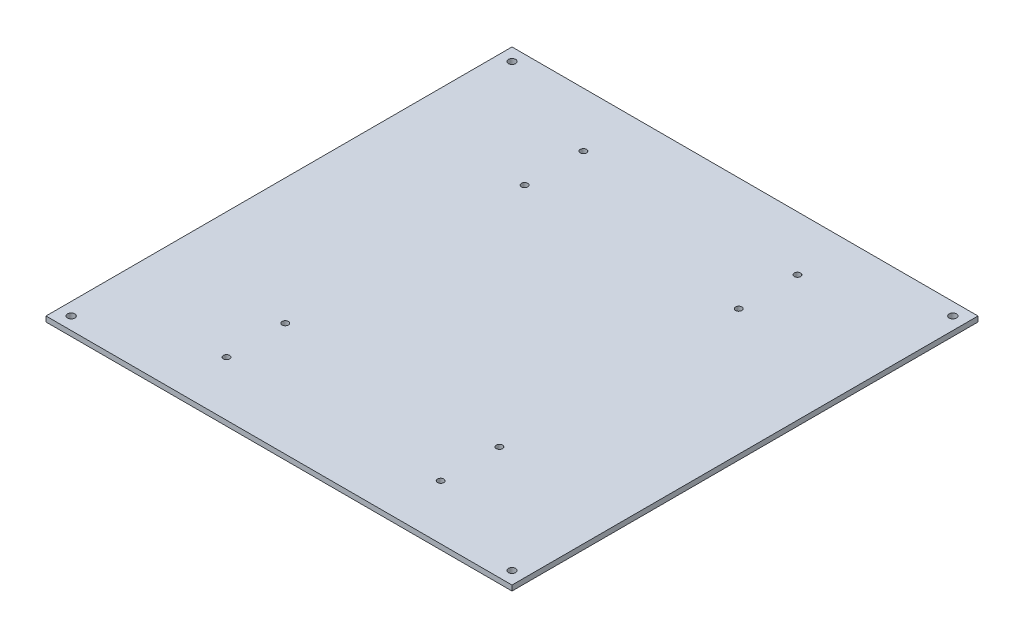
ISO-10303-21;
HEADER;
FILE_DESCRIPTION(('STEP AP214'),'2;1');
FILE_NAME('part.step','',(''),(''),'','','');
FILE_SCHEMA(('AUTOMOTIVE_DESIGN { 1 0 10303 214 1 1 1 1 }'));
ENDSEC;
DATA;
#1=APPLICATION_CONTEXT('core data for automotive mechanical design processes');
#2=APPLICATION_PROTOCOL_DEFINITION('international standard','automotive_design',2000,#1);
#3=PRODUCT_CONTEXT('',#1,'mechanical');
#4=PRODUCT('Part','Part','',(#3));
#5=PRODUCT_RELATED_PRODUCT_CATEGORY('part','',(#4));
#6=PRODUCT_DEFINITION_FORMATION('','',#4);
#7=PRODUCT_DEFINITION_CONTEXT('part definition',#1,'design');
#8=PRODUCT_DEFINITION('design','',#6,#7);
#9=PRODUCT_DEFINITION_SHAPE('','',#8);
#10=(LENGTH_UNIT() NAMED_UNIT(*) SI_UNIT(.MILLI.,.METRE.));
#11=(NAMED_UNIT(*) PLANE_ANGLE_UNIT() SI_UNIT($,.RADIAN.));
#12=(NAMED_UNIT(*) SI_UNIT($,.STERADIAN.) SOLID_ANGLE_UNIT());
#13=UNCERTAINTY_MEASURE_WITH_UNIT(LENGTH_MEASURE(1.E-05),#10,'distance_accuracy_value','');
#14=(GEOMETRIC_REPRESENTATION_CONTEXT(3) GLOBAL_UNCERTAINTY_ASSIGNED_CONTEXT((#13)) GLOBAL_UNIT_ASSIGNED_CONTEXT((#10,
#11,#12)) REPRESENTATION_CONTEXT('',''));
#15=CARTESIAN_POINT('',(0.,0.,0.));
#16=DIRECTION('',(0.,0.,1.));
#17=DIRECTION('',(1.,0.,0.));
#18=AXIS2_PLACEMENT_3D('',#15,#16,#17);
#19=CARTESIAN_POINT('',(0.,2.5,0.));
#20=DIRECTION('',(0.,-1.,0.));
#21=DIRECTION('',(0.,0.,-1.));
#22=AXIS2_PLACEMENT_3D('',#19,#20,#21);
#23=PLANE('',#22);
#24=CARTESIAN_POINT('',(60.,2.5,-54.));
#25=DIRECTION('',(0.,-1.,0.));
#26=DIRECTION('',(0.,0.,-1.));
#27=AXIS2_PLACEMENT_3D('',#24,#25,#26);
#28=CIRCLE('',#27,1.5);
#29=CARTESIAN_POINT('',(60.,2.5,-55.5));
#30=VERTEX_POINT('',#29);
#31=EDGE_CURVE('E143',#30,#30,#28,.T.);
#32=ORIENTED_EDGE('',*,*,#31,.T.);
#33=EDGE_LOOP('',(#32));
#34=FACE_BOUND('',#33,.T.);
#35=CARTESIAN_POINT('',(59.9999999999999,2.5,-168.));
#36=DIRECTION('',(0.,-1.,0.));
#37=DIRECTION('',(0.,0.,1.));
#38=AXIS2_PLACEMENT_3D('',#35,#36,#37);
#39=CIRCLE('',#38,1.5);
#40=CARTESIAN_POINT('',(59.9999999999999,2.5,-166.5));
#41=VERTEX_POINT('',#40);
#42=EDGE_CURVE('E162',#41,#41,#39,.T.);
#43=ORIENTED_EDGE('',*,*,#42,.T.);
#44=EDGE_LOOP('',(#43));
#45=FACE_BOUND('',#44,.T.);
#46=CARTESIAN_POINT('',(59.9999999999999,2.5,-196.));
#47=DIRECTION('',(0.,-1.,0.));
#48=DIRECTION('',(0.,0.,1.));
#49=AXIS2_PLACEMENT_3D('',#46,#47,#48);
#50=CIRCLE('',#49,1.5);
#51=CARTESIAN_POINT('',(59.9999999999999,2.5,-194.5));
#52=VERTEX_POINT('',#51);
#53=EDGE_CURVE('E156',#52,#52,#50,.T.);
#54=ORIENTED_EDGE('',*,*,#53,.T.);
#55=EDGE_LOOP('',(#54));
#56=FACE_BOUND('',#55,.T.);
#57=CARTESIAN_POINT('',(162.,2.5,-196.));
#58=DIRECTION('',(0.,-1.,0.));
#59=DIRECTION('',(0.,0.,-1.));
#60=AXIS2_PLACEMENT_3D('',#57,#58,#59);
#61=CIRCLE('',#60,1.5);
#62=CARTESIAN_POINT('',(162.,2.5,-197.5));
#63=VERTEX_POINT('',#62);
#64=EDGE_CURVE('E149',#63,#63,#61,.T.);
#65=ORIENTED_EDGE('',*,*,#64,.T.);
#66=EDGE_LOOP('',(#65));
#67=FACE_BOUND('',#66,.T.);
#68=CARTESIAN_POINT('',(162.,2.5,-168.));
#69=DIRECTION('',(0.,-1.,0.));
#70=DIRECTION('',(0.,0.,-1.));
#71=AXIS2_PLACEMENT_3D('',#68,#69,#70);
#72=CIRCLE('',#71,1.5);
#73=CARTESIAN_POINT('',(162.,2.5,-169.5));
#74=VERTEX_POINT('',#73);
#75=EDGE_CURVE('E150',#74,#74,#72,.T.);
#76=ORIENTED_EDGE('',*,*,#75,.T.);
#77=EDGE_LOOP('',(#76));
#78=FACE_BOUND('',#77,.T.);
#79=CARTESIAN_POINT('',(162.,2.5,-54.));
#80=DIRECTION('',(0.,-1.,0.));
#81=DIRECTION('',(0.,0.,1.));
#82=AXIS2_PLACEMENT_3D('',#79,#80,#81);
#83=CIRCLE('',#82,1.5);
#84=CARTESIAN_POINT('',(162.,2.5,-52.5));
#85=VERTEX_POINT('',#84);
#86=EDGE_CURVE('E179',#85,#85,#83,.T.);
#87=ORIENTED_EDGE('',*,*,#86,.T.);
#88=EDGE_LOOP('',(#87));
#89=FACE_BOUND('',#88,.T.);
#90=CARTESIAN_POINT('',(162.,2.5,-26.));
#91=DIRECTION('',(0.,-1.,0.));
#92=DIRECTION('',(0.,0.,1.));
#93=AXIS2_PLACEMENT_3D('',#90,#91,#92);
#94=CIRCLE('',#93,1.5);
#95=CARTESIAN_POINT('',(162.,2.5,-24.5));
#96=VERTEX_POINT('',#95);
#97=EDGE_CURVE('E173',#96,#96,#94,.T.);
#98=ORIENTED_EDGE('',*,*,#97,.T.);
#99=EDGE_LOOP('',(#98));
#100=FACE_BOUND('',#99,.T.);
#101=CARTESIAN_POINT('',(60.,2.5,-26.));
#102=DIRECTION('',(0.,-1.,0.));
#103=DIRECTION('',(0.,0.,-1.));
#104=AXIS2_PLACEMENT_3D('',#101,#102,#103);
#105=CIRCLE('',#104,1.5);
#106=CARTESIAN_POINT('',(60.,2.5,-27.5));
#107=VERTEX_POINT('',#106);
#108=EDGE_CURVE('E137',#107,#107,#105,.T.);
#109=ORIENTED_EDGE('',*,*,#108,.T.);
#110=EDGE_LOOP('',(#109));
#111=FACE_BOUND('',#110,.T.);
#112=DIRECTION('',(0.,0.,1.));
#113=VECTOR('',#112,1.);
#114=CARTESIAN_POINT('',(0.,2.5,0.));
#115=LINE('',#114,#113);
#116=CARTESIAN_POINT('',(0.,2.5,-222.));
#117=VERTEX_POINT('',#116);
#118=CARTESIAN_POINT('',(0.,2.5,0.));
#119=VERTEX_POINT('',#118);
#120=EDGE_CURVE('E89',#117,#119,#115,.T.);
#121=ORIENTED_EDGE('',*,*,#120,.T.);
#122=DIRECTION('',(1.,0.,0.));
#123=VECTOR('',#122,1.);
#124=CARTESIAN_POINT('',(0.,2.5,0.));
#125=LINE('',#124,#123);
#126=CARTESIAN_POINT('',(222.,2.5,0.));
#127=VERTEX_POINT('',#126);
#128=EDGE_CURVE('E84',#119,#127,#125,.T.);
#129=ORIENTED_EDGE('',*,*,#128,.T.);
#130=DIRECTION('',(0.,0.,-1.));
#131=VECTOR('',#130,1.);
#132=CARTESIAN_POINT('',(222.,2.5,0.));
#133=LINE('',#132,#131);
#134=CARTESIAN_POINT('',(222.,2.5,-222.));
#135=VERTEX_POINT('',#134);
#136=EDGE_CURVE('E87',#127,#135,#133,.T.);
#137=ORIENTED_EDGE('',*,*,#136,.T.);
#138=DIRECTION('',(-1.,0.,0.));
#139=VECTOR('',#138,1.);
#140=CARTESIAN_POINT('',(0.,2.5,-222.));
#141=LINE('',#140,#139);
#142=EDGE_CURVE('E54',#135,#117,#141,.T.);
#143=ORIENTED_EDGE('',*,*,#142,.T.);
#144=EDGE_LOOP('',(#121,#129,#137,#143));
#145=FACE_BOUND('',#144,.T.);
#146=CARTESIAN_POINT('',(6.00000000000005,2.5,-6.00000000000003));
#147=DIRECTION('',(0.,1.,0.));
#148=DIRECTION('',(0.,0.,1.));
#149=AXIS2_PLACEMENT_3D('',#146,#147,#148);
#150=CIRCLE('',#149,1.75);
#151=CARTESIAN_POINT('',(6.00000000000005,2.5,-4.25000000000002));
#152=VERTEX_POINT('',#151);
#153=EDGE_CURVE('E104',#152,#152,#150,.T.);
#154=ORIENTED_EDGE('',*,*,#153,.F.);
#155=EDGE_LOOP('',(#154));
#156=FACE_BOUND('',#155,.T.);
#157=CARTESIAN_POINT('',(216.,2.5,-6.00000000000007));
#158=DIRECTION('',(0.,1.,0.));
#159=DIRECTION('',(0.,0.,1.));
#160=AXIS2_PLACEMENT_3D('',#157,#158,#159);
#161=CIRCLE('',#160,1.75000000000001);
#162=CARTESIAN_POINT('',(216.,2.5,-4.25000000000006));
#163=VERTEX_POINT('',#162);
#164=EDGE_CURVE('E119',#163,#163,#161,.T.);
#165=ORIENTED_EDGE('',*,*,#164,.F.);
#166=EDGE_LOOP('',(#165));
#167=FACE_BOUND('',#166,.T.);
#168=CARTESIAN_POINT('',(216.,2.5,-216.));
#169=DIRECTION('',(0.,1.,0.));
#170=DIRECTION('',(0.,0.,1.));
#171=AXIS2_PLACEMENT_3D('',#168,#169,#170);
#172=CIRCLE('',#171,1.75000000000001);
#173=CARTESIAN_POINT('',(216.,2.5,-214.25));
#174=VERTEX_POINT('',#173);
#175=EDGE_CURVE('E125',#174,#174,#172,.T.);
#176=ORIENTED_EDGE('',*,*,#175,.F.);
#177=EDGE_LOOP('',(#176));
#178=FACE_BOUND('',#177,.T.);
#179=CARTESIAN_POINT('',(6.00000000000001,2.5,-216.));
#180=DIRECTION('',(0.,1.,0.));
#181=DIRECTION('',(0.,0.,1.));
#182=AXIS2_PLACEMENT_3D('',#179,#180,#181);
#183=CIRCLE('',#182,1.75);
#184=CARTESIAN_POINT('',(6.00000000000001,2.5,-214.25));
#185=VERTEX_POINT('',#184);
#186=EDGE_CURVE('E131',#185,#185,#183,.T.);
#187=ORIENTED_EDGE('',*,*,#186,.F.);
#188=EDGE_LOOP('',(#187));
#189=FACE_BOUND('',#188,.T.);
#190=ADVANCED_FACE('F37',(#34,#45,#56,#67,#78,#89,#100,#111,#145,#156,#167,#178,#189),#23,.F.);
#191=CARTESIAN_POINT('',(0.,0.,0.));
#192=DIRECTION('',(0.,-1.,0.));
#193=DIRECTION('',(0.,0.,-1.));
#194=AXIS2_PLACEMENT_3D('',#191,#192,#193);
#195=PLANE('',#194);
#196=CARTESIAN_POINT('',(60.,0.,-54.));
#197=DIRECTION('',(0.,-1.,0.));
#198=DIRECTION('',(0.,0.,-1.));
#199=AXIS2_PLACEMENT_3D('',#196,#197,#198);
#200=CIRCLE('',#199,1.5);
#201=CARTESIAN_POINT('',(60.,0.,-55.5));
#202=VERTEX_POINT('',#201);
#203=EDGE_CURVE('E165',#202,#202,#200,.T.);
#204=ORIENTED_EDGE('',*,*,#203,.F.);
#205=EDGE_LOOP('',(#204));
#206=FACE_BOUND('',#205,.T.);
#207=CARTESIAN_POINT('',(59.9999999999999,0.,-168.));
#208=DIRECTION('',(0.,-1.,0.));
#209=DIRECTION('',(0.,0.,1.));
#210=AXIS2_PLACEMENT_3D('',#207,#208,#209);
#211=CIRCLE('',#210,1.5);
#212=CARTESIAN_POINT('',(59.9999999999999,0.,-166.5));
#213=VERTEX_POINT('',#212);
#214=EDGE_CURVE('E159',#213,#213,#211,.T.);
#215=ORIENTED_EDGE('',*,*,#214,.F.);
#216=EDGE_LOOP('',(#215));
#217=FACE_BOUND('',#216,.T.);
#218=CARTESIAN_POINT('',(59.9999999999999,0.,-196.));
#219=DIRECTION('',(0.,-1.,0.));
#220=DIRECTION('',(0.,0.,1.));
#221=AXIS2_PLACEMENT_3D('',#218,#219,#220);
#222=CIRCLE('',#221,1.5);
#223=CARTESIAN_POINT('',(59.9999999999999,0.,-194.5));
#224=VERTEX_POINT('',#223);
#225=EDGE_CURVE('E153',#224,#224,#222,.T.);
#226=ORIENTED_EDGE('',*,*,#225,.F.);
#227=EDGE_LOOP('',(#226));
#228=FACE_BOUND('',#227,.T.);
#229=CARTESIAN_POINT('',(162.,0.,-196.));
#230=DIRECTION('',(0.,-1.,0.));
#231=DIRECTION('',(0.,0.,-1.));
#232=AXIS2_PLACEMENT_3D('',#229,#230,#231);
#233=CIRCLE('',#232,1.5);
#234=CARTESIAN_POINT('',(162.,0.,-197.5));
#235=VERTEX_POINT('',#234);
#236=EDGE_CURVE('E146',#235,#235,#233,.T.);
#237=ORIENTED_EDGE('',*,*,#236,.F.);
#238=EDGE_LOOP('',(#237));
#239=FACE_BOUND('',#238,.T.);
#240=CARTESIAN_POINT('',(162.,0.,-168.));
#241=DIRECTION('',(0.,-1.,0.));
#242=DIRECTION('',(0.,0.,-1.));
#243=AXIS2_PLACEMENT_3D('',#240,#241,#242);
#244=CIRCLE('',#243,1.5);
#245=CARTESIAN_POINT('',(162.,0.,-169.5));
#246=VERTEX_POINT('',#245);
#247=EDGE_CURVE('E182',#246,#246,#244,.T.);
#248=ORIENTED_EDGE('',*,*,#247,.F.);
#249=EDGE_LOOP('',(#248));
#250=FACE_BOUND('',#249,.T.);
#251=CARTESIAN_POINT('',(162.,0.,-54.));
#252=DIRECTION('',(0.,-1.,0.));
#253=DIRECTION('',(0.,0.,1.));
#254=AXIS2_PLACEMENT_3D('',#251,#252,#253);
#255=CIRCLE('',#254,1.5);
#256=CARTESIAN_POINT('',(162.,0.,-52.5));
#257=VERTEX_POINT('',#256);
#258=EDGE_CURVE('E176',#257,#257,#255,.T.);
#259=ORIENTED_EDGE('',*,*,#258,.F.);
#260=EDGE_LOOP('',(#259));
#261=FACE_BOUND('',#260,.T.);
#262=CARTESIAN_POINT('',(162.,0.,-26.));
#263=DIRECTION('',(0.,-1.,0.));
#264=DIRECTION('',(0.,0.,1.));
#265=AXIS2_PLACEMENT_3D('',#262,#263,#264);
#266=CIRCLE('',#265,1.5);
#267=CARTESIAN_POINT('',(162.,0.,-24.5));
#268=VERTEX_POINT('',#267);
#269=EDGE_CURVE('E170',#268,#268,#266,.T.);
#270=ORIENTED_EDGE('',*,*,#269,.F.);
#271=EDGE_LOOP('',(#270));
#272=FACE_BOUND('',#271,.T.);
#273=CARTESIAN_POINT('',(60.,0.,-26.));
#274=DIRECTION('',(0.,-1.,0.));
#275=DIRECTION('',(0.,0.,-1.));
#276=AXIS2_PLACEMENT_3D('',#273,#274,#275);
#277=CIRCLE('',#276,1.5);
#278=CARTESIAN_POINT('',(60.,0.,-27.5));
#279=VERTEX_POINT('',#278);
#280=EDGE_CURVE('E140',#279,#279,#277,.T.);
#281=ORIENTED_EDGE('',*,*,#280,.F.);
#282=EDGE_LOOP('',(#281));
#283=FACE_BOUND('',#282,.T.);
#284=CARTESIAN_POINT('',(216.,0.,-216.));
#285=DIRECTION('',(0.,1.,0.));
#286=DIRECTION('',(0.,0.,1.));
#287=AXIS2_PLACEMENT_3D('',#284,#285,#286);
#288=CIRCLE('',#287,1.75000000000001);
#289=CARTESIAN_POINT('',(216.,0.,-214.25));
#290=VERTEX_POINT('',#289);
#291=EDGE_CURVE('E128',#290,#290,#288,.T.);
#292=ORIENTED_EDGE('',*,*,#291,.T.);
#293=EDGE_LOOP('',(#292));
#294=FACE_BOUND('',#293,.T.);
#295=CARTESIAN_POINT('',(6.00000000000005,0.,-6.00000000000003));
#296=DIRECTION('',(0.,1.,0.));
#297=DIRECTION('',(0.,0.,1.));
#298=AXIS2_PLACEMENT_3D('',#295,#296,#297);
#299=CIRCLE('',#298,1.75);
#300=CARTESIAN_POINT('',(6.00000000000005,0.,-4.25000000000002));
#301=VERTEX_POINT('',#300);
#302=EDGE_CURVE('E116',#301,#301,#299,.T.);
#303=ORIENTED_EDGE('',*,*,#302,.T.);
#304=EDGE_LOOP('',(#303));
#305=FACE_BOUND('',#304,.T.);
#306=DIRECTION('',(0.,0.,1.));
#307=VECTOR('',#306,1.);
#308=CARTESIAN_POINT('',(0.,0.,0.));
#309=LINE('',#308,#307);
#310=CARTESIAN_POINT('',(0.,0.,-222.));
#311=VERTEX_POINT('',#310);
#312=CARTESIAN_POINT('',(0.,0.,0.));
#313=VERTEX_POINT('',#312);
#314=EDGE_CURVE('E101',#311,#313,#309,.T.);
#315=ORIENTED_EDGE('',*,*,#314,.F.);
#316=DIRECTION('',(-1.,0.,0.));
#317=VECTOR('',#316,1.);
#318=CARTESIAN_POINT('',(0.,0.,-222.));
#319=LINE('',#318,#317);
#320=CARTESIAN_POINT('',(222.,0.,-222.));
#321=VERTEX_POINT('',#320);
#322=EDGE_CURVE('E77',#321,#311,#319,.T.);
#323=ORIENTED_EDGE('',*,*,#322,.F.);
#324=DIRECTION('',(0.,0.,-1.));
#325=VECTOR('',#324,1.);
#326=CARTESIAN_POINT('',(222.,0.,0.));
#327=LINE('',#326,#325);
#328=CARTESIAN_POINT('',(222.,0.,0.));
#329=VERTEX_POINT('',#328);
#330=EDGE_CURVE('E71',#329,#321,#327,.T.);
#331=ORIENTED_EDGE('',*,*,#330,.F.);
#332=DIRECTION('',(1.,0.,0.));
#333=VECTOR('',#332,1.);
#334=CARTESIAN_POINT('',(0.,0.,0.));
#335=LINE('',#334,#333);
#336=EDGE_CURVE('E93',#313,#329,#335,.T.);
#337=ORIENTED_EDGE('',*,*,#336,.F.);
#338=EDGE_LOOP('',(#315,#323,#331,#337));
#339=FACE_BOUND('',#338,.T.);
#340=CARTESIAN_POINT('',(216.,0.,-6.00000000000007));
#341=DIRECTION('',(0.,1.,0.));
#342=DIRECTION('',(0.,0.,1.));
#343=AXIS2_PLACEMENT_3D('',#340,#341,#342);
#344=CIRCLE('',#343,1.75000000000001);
#345=CARTESIAN_POINT('',(216.,0.,-4.25000000000006));
#346=VERTEX_POINT('',#345);
#347=EDGE_CURVE('E122',#346,#346,#344,.T.);
#348=ORIENTED_EDGE('',*,*,#347,.T.);
#349=EDGE_LOOP('',(#348));
#350=FACE_BOUND('',#349,.T.);
#351=CARTESIAN_POINT('',(6.00000000000001,0.,-216.));
#352=DIRECTION('',(0.,1.,0.));
#353=DIRECTION('',(0.,0.,1.));
#354=AXIS2_PLACEMENT_3D('',#351,#352,#353);
#355=CIRCLE('',#354,1.75);
#356=CARTESIAN_POINT('',(6.00000000000001,0.,-214.25));
#357=VERTEX_POINT('',#356);
#358=EDGE_CURVE('E134',#357,#357,#355,.T.);
#359=ORIENTED_EDGE('',*,*,#358,.T.);
#360=EDGE_LOOP('',(#359));
#361=FACE_BOUND('',#360,.T.);
#362=ADVANCED_FACE('F112',(#206,#217,#228,#239,#250,#261,#272,#283,#294,#305,#339,#350,#361),
#195,.T.);
#363=CARTESIAN_POINT('',(0.,2.5,0.));
#364=DIRECTION('',(1.,0.,0.));
#365=DIRECTION('',(0.,0.,-1.));
#366=AXIS2_PLACEMENT_3D('',#363,#364,#365);
#367=PLANE('',#366);
#368=ORIENTED_EDGE('',*,*,#314,.T.);
#369=DIRECTION('',(0.,-1.,0.));
#370=VECTOR('',#369,1.);
#371=CARTESIAN_POINT('',(0.,2.5,0.));
#372=LINE('',#371,#370);
#373=EDGE_CURVE('E11',#119,#313,#372,.T.);
#374=ORIENTED_EDGE('',*,*,#373,.F.);
#375=ORIENTED_EDGE('',*,*,#120,.F.);
#376=DIRECTION('',(0.,-1.,0.));
#377=VECTOR('',#376,1.);
#378=CARTESIAN_POINT('',(0.,2.5,-222.));
#379=LINE('',#378,#377);
#380=EDGE_CURVE('E97',#117,#311,#379,.T.);
#381=ORIENTED_EDGE('',*,*,#380,.T.);
#382=EDGE_LOOP('',(#368,#374,#375,#381));
#383=FACE_BOUND('',#382,.T.);
#384=ADVANCED_FACE('F39',(#383),#367,.F.);
#385=CARTESIAN_POINT('',(0.,2.5,0.));
#386=DIRECTION('',(0.,0.,-1.));
#387=DIRECTION('',(-1.,0.,0.));
#388=AXIS2_PLACEMENT_3D('',#385,#386,#387);
#389=PLANE('',#388);
#390=ORIENTED_EDGE('',*,*,#336,.T.);
#391=DIRECTION('',(0.,-1.,0.));
#392=VECTOR('',#391,1.);
#393=CARTESIAN_POINT('',(222.,2.5,0.));
#394=LINE('',#393,#392);
#395=EDGE_CURVE('E46',#127,#329,#394,.T.);
#396=ORIENTED_EDGE('',*,*,#395,.F.);
#397=ORIENTED_EDGE('',*,*,#128,.F.);
#398=ORIENTED_EDGE('',*,*,#373,.T.);
#399=EDGE_LOOP('',(#390,#396,#397,#398));
#400=FACE_BOUND('',#399,.T.);
#401=ADVANCED_FACE('F92',(#400),#389,.F.);
#402=CARTESIAN_POINT('',(222.,2.5,0.));
#403=DIRECTION('',(-1.,0.,0.));
#404=DIRECTION('',(0.,0.,1.));
#405=AXIS2_PLACEMENT_3D('',#402,#403,#404);
#406=PLANE('',#405);
#407=ORIENTED_EDGE('',*,*,#330,.T.);
#408=DIRECTION('',(0.,-1.,0.));
#409=VECTOR('',#408,1.);
#410=CARTESIAN_POINT('',(222.,2.5,-222.));
#411=LINE('',#410,#409);
#412=EDGE_CURVE('E94',#135,#321,#411,.T.);
#413=ORIENTED_EDGE('',*,*,#412,.F.);
#414=ORIENTED_EDGE('',*,*,#136,.F.);
#415=ORIENTED_EDGE('',*,*,#395,.T.);
#416=EDGE_LOOP('',(#407,#413,#414,#415));
#417=FACE_BOUND('',#416,.T.);
#418=ADVANCED_FACE('F95',(#417),#406,.F.);
#419=CARTESIAN_POINT('',(0.,2.5,-222.));
#420=DIRECTION('',(0.,0.,1.));
#421=DIRECTION('',(1.,0.,0.));
#422=AXIS2_PLACEMENT_3D('',#419,#420,#421);
#423=PLANE('',#422);
#424=ORIENTED_EDGE('',*,*,#322,.T.);
#425=ORIENTED_EDGE('',*,*,#380,.F.);
#426=ORIENTED_EDGE('',*,*,#142,.F.);
#427=ORIENTED_EDGE('',*,*,#412,.T.);
#428=EDGE_LOOP('',(#424,#425,#426,#427));
#429=FACE_BOUND('',#428,.T.);
#430=ADVANCED_FACE('F109',(#429),#423,.F.);
#431=CARTESIAN_POINT('',(6.00000000000005,2.5,-6.00000000000003));
#432=DIRECTION('',(0.,-1.,0.));
#433=DIRECTION('',(0.,0.,-1.));
#434=AXIS2_PLACEMENT_3D('',#431,#432,#433);
#435=CYLINDRICAL_SURFACE('',#434,1.75);
#436=ORIENTED_EDGE('',*,*,#153,.T.);
#437=EDGE_LOOP('',(#436));
#438=FACE_BOUND('',#437,.T.);
#439=ORIENTED_EDGE('',*,*,#302,.F.);
#440=EDGE_LOOP('',(#439));
#441=FACE_BOUND('',#440,.T.);
#442=ADVANCED_FACE('F212',(#438,#441),#435,.F.);
#443=CARTESIAN_POINT('',(216.,2.5,-6.00000000000007));
#444=DIRECTION('',(0.,-1.,0.));
#445=DIRECTION('',(0.,0.,-1.));
#446=AXIS2_PLACEMENT_3D('',#443,#444,#445);
#447=CYLINDRICAL_SURFACE('',#446,1.75000000000001);
#448=ORIENTED_EDGE('',*,*,#164,.T.);
#449=EDGE_LOOP('',(#448));
#450=FACE_BOUND('',#449,.T.);
#451=ORIENTED_EDGE('',*,*,#347,.F.);
#452=EDGE_LOOP('',(#451));
#453=FACE_BOUND('',#452,.T.);
#454=ADVANCED_FACE('F214',(#450,#453),#447,.F.);
#455=CARTESIAN_POINT('',(216.,2.5,-216.));
#456=DIRECTION('',(0.,-1.,0.));
#457=DIRECTION('',(0.,0.,-1.));
#458=AXIS2_PLACEMENT_3D('',#455,#456,#457);
#459=CYLINDRICAL_SURFACE('',#458,1.75000000000001);
#460=ORIENTED_EDGE('',*,*,#175,.T.);
#461=EDGE_LOOP('',(#460));
#462=FACE_BOUND('',#461,.T.);
#463=ORIENTED_EDGE('',*,*,#291,.F.);
#464=EDGE_LOOP('',(#463));
#465=FACE_BOUND('',#464,.T.);
#466=ADVANCED_FACE('F221',(#462,#465),#459,.F.);
#467=CARTESIAN_POINT('',(6.00000000000001,2.5,-216.));
#468=DIRECTION('',(0.,-1.,0.));
#469=DIRECTION('',(0.,0.,-1.));
#470=AXIS2_PLACEMENT_3D('',#467,#468,#469);
#471=CYLINDRICAL_SURFACE('',#470,1.75);
#472=ORIENTED_EDGE('',*,*,#186,.T.);
#473=EDGE_LOOP('',(#472));
#474=FACE_BOUND('',#473,.T.);
#475=ORIENTED_EDGE('',*,*,#358,.F.);
#476=EDGE_LOOP('',(#475));
#477=FACE_BOUND('',#476,.T.);
#478=ADVANCED_FACE('F257',(#474,#477),#471,.F.);
#479=CARTESIAN_POINT('',(60.,2.5,-26.));
#480=DIRECTION('',(0.,-1.,0.));
#481=DIRECTION('',(0.,0.,-1.));
#482=AXIS2_PLACEMENT_3D('',#479,#480,#481);
#483=CYLINDRICAL_SURFACE('',#482,1.5);
#484=ORIENTED_EDGE('',*,*,#108,.F.);
#485=EDGE_LOOP('',(#484));
#486=FACE_BOUND('',#485,.T.);
#487=ORIENTED_EDGE('',*,*,#280,.T.);
#488=EDGE_LOOP('',(#487));
#489=FACE_BOUND('',#488,.T.);
#490=ADVANCED_FACE('F251',(#486,#489),#483,.F.);
#491=CARTESIAN_POINT('',(162.,2.5,-26.));
#492=DIRECTION('',(0.,-1.,0.));
#493=DIRECTION('',(0.,0.,-1.));
#494=AXIS2_PLACEMENT_3D('',#491,#492,#493);
#495=CYLINDRICAL_SURFACE('',#494,1.5);
#496=ORIENTED_EDGE('',*,*,#97,.F.);
#497=EDGE_LOOP('',(#496));
#498=FACE_BOUND('',#497,.T.);
#499=ORIENTED_EDGE('',*,*,#269,.T.);
#500=EDGE_LOOP('',(#499));
#501=FACE_BOUND('',#500,.T.);
#502=ADVANCED_FACE('F256',(#498,#501),#495,.F.);
#503=CARTESIAN_POINT('',(162.,2.5,-54.));
#504=DIRECTION('',(0.,-1.,0.));
#505=DIRECTION('',(0.,0.,-1.));
#506=AXIS2_PLACEMENT_3D('',#503,#504,#505);
#507=CYLINDRICAL_SURFACE('',#506,1.5);
#508=ORIENTED_EDGE('',*,*,#86,.F.);
#509=EDGE_LOOP('',(#508));
#510=FACE_BOUND('',#509,.T.);
#511=ORIENTED_EDGE('',*,*,#258,.T.);
#512=EDGE_LOOP('',(#511));
#513=FACE_BOUND('',#512,.T.);
#514=ADVANCED_FACE('F194',(#510,#513),#507,.F.);
#515=CARTESIAN_POINT('',(162.,2.5,-168.));
#516=DIRECTION('',(0.,-1.,0.));
#517=DIRECTION('',(0.,0.,-1.));
#518=AXIS2_PLACEMENT_3D('',#515,#516,#517);
#519=CYLINDRICAL_SURFACE('',#518,1.5);
#520=ORIENTED_EDGE('',*,*,#75,.F.);
#521=EDGE_LOOP('',(#520));
#522=FACE_BOUND('',#521,.T.);
#523=ORIENTED_EDGE('',*,*,#247,.T.);
#524=EDGE_LOOP('',(#523));
#525=FACE_BOUND('',#524,.T.);
#526=ADVANCED_FACE('F190',(#522,#525),#519,.F.);
#527=CARTESIAN_POINT('',(162.,2.5,-196.));
#528=DIRECTION('',(0.,-1.,0.));
#529=DIRECTION('',(0.,0.,-1.));
#530=AXIS2_PLACEMENT_3D('',#527,#528,#529);
#531=CYLINDRICAL_SURFACE('',#530,1.5);
#532=ORIENTED_EDGE('',*,*,#64,.F.);
#533=EDGE_LOOP('',(#532));
#534=FACE_BOUND('',#533,.T.);
#535=ORIENTED_EDGE('',*,*,#236,.T.);
#536=EDGE_LOOP('',(#535));
#537=FACE_BOUND('',#536,.T.);
#538=ADVANCED_FACE('F193',(#534,#537),#531,.F.);
#539=CARTESIAN_POINT('',(59.9999999999999,2.5,-196.));
#540=DIRECTION('',(0.,-1.,0.));
#541=DIRECTION('',(0.,0.,-1.));
#542=AXIS2_PLACEMENT_3D('',#539,#540,#541);
#543=CYLINDRICAL_SURFACE('',#542,1.5);
#544=ORIENTED_EDGE('',*,*,#53,.F.);
#545=EDGE_LOOP('',(#544));
#546=FACE_BOUND('',#545,.T.);
#547=ORIENTED_EDGE('',*,*,#225,.T.);
#548=EDGE_LOOP('',(#547));
#549=FACE_BOUND('',#548,.T.);
#550=ADVANCED_FACE('F293',(#546,#549),#543,.F.);
#551=CARTESIAN_POINT('',(59.9999999999999,2.5,-168.));
#552=DIRECTION('',(0.,-1.,0.));
#553=DIRECTION('',(0.,0.,-1.));
#554=AXIS2_PLACEMENT_3D('',#551,#552,#553);
#555=CYLINDRICAL_SURFACE('',#554,1.5);
#556=ORIENTED_EDGE('',*,*,#42,.F.);
#557=EDGE_LOOP('',(#556));
#558=FACE_BOUND('',#557,.T.);
#559=ORIENTED_EDGE('',*,*,#214,.T.);
#560=EDGE_LOOP('',(#559));
#561=FACE_BOUND('',#560,.T.);
#562=ADVANCED_FACE('F303',(#558,#561),#555,.F.);
#563=CARTESIAN_POINT('',(60.,2.5,-54.));
#564=DIRECTION('',(0.,-1.,0.));
#565=DIRECTION('',(0.,0.,-1.));
#566=AXIS2_PLACEMENT_3D('',#563,#564,#565);
#567=CYLINDRICAL_SURFACE('',#566,1.5);
#568=ORIENTED_EDGE('',*,*,#31,.F.);
#569=EDGE_LOOP('',(#568));
#570=FACE_BOUND('',#569,.T.);
#571=ORIENTED_EDGE('',*,*,#203,.T.);
#572=EDGE_LOOP('',(#571));
#573=FACE_BOUND('',#572,.T.);
#574=ADVANCED_FACE('F313',(#570,#573),#567,.F.);
#575=CLOSED_SHELL('',(#190,#362,#384,#401,#418,#430,#442,#454,#466,#478,#490,#502,#514,#526,
#538,#550,#562,#574));
#576=MANIFOLD_SOLID_BREP('B2',#575);
#577=ADVANCED_BREP_SHAPE_REPRESENTATION('',(#18,#576),#14);
#578=SHAPE_DEFINITION_REPRESENTATION(#9,#577);
ENDSEC;
END-ISO-10303-21;
